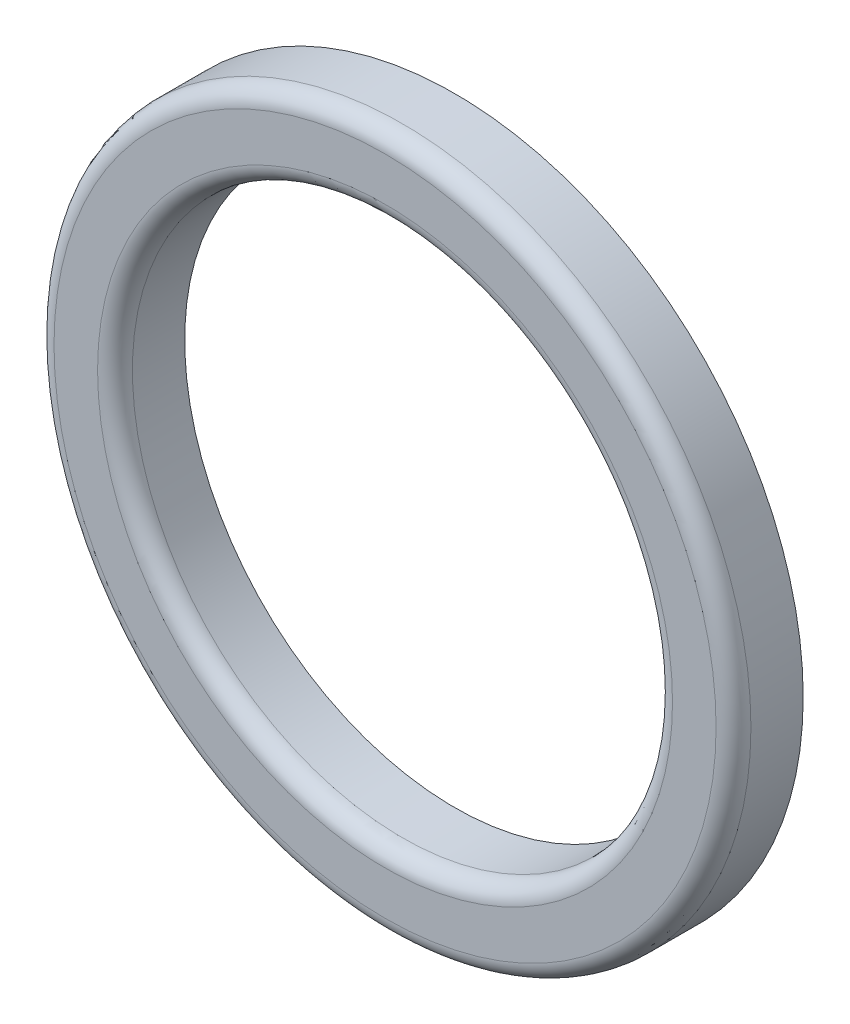
ISO-10303-21;
HEADER;
FILE_DESCRIPTION(('STEP AP214'),'2;1');
FILE_NAME('part.step','',(''),(''),'','','');
FILE_SCHEMA(('AUTOMOTIVE_DESIGN { 1 0 10303 214 1 1 1 1 }'));
ENDSEC;
DATA;
#1=APPLICATION_CONTEXT('core data for automotive mechanical design processes');
#2=APPLICATION_PROTOCOL_DEFINITION('international standard','automotive_design',2000,#1);
#3=PRODUCT_CONTEXT('',#1,'mechanical');
#4=PRODUCT('Part','Part','',(#3));
#5=PRODUCT_RELATED_PRODUCT_CATEGORY('part','',(#4));
#6=PRODUCT_DEFINITION_FORMATION('','',#4);
#7=PRODUCT_DEFINITION_CONTEXT('part definition',#1,'design');
#8=PRODUCT_DEFINITION('design','',#6,#7);
#9=PRODUCT_DEFINITION_SHAPE('','',#8);
#10=(LENGTH_UNIT() NAMED_UNIT(*) SI_UNIT(.MILLI.,.METRE.));
#11=(NAMED_UNIT(*) PLANE_ANGLE_UNIT() SI_UNIT($,.RADIAN.));
#12=(NAMED_UNIT(*) SI_UNIT($,.STERADIAN.) SOLID_ANGLE_UNIT());
#13=UNCERTAINTY_MEASURE_WITH_UNIT(LENGTH_MEASURE(1.E-05),#10,'distance_accuracy_value','');
#14=(GEOMETRIC_REPRESENTATION_CONTEXT(3) GLOBAL_UNCERTAINTY_ASSIGNED_CONTEXT((#13)) GLOBAL_UNIT_ASSIGNED_CONTEXT((#10,
#11,#12)) REPRESENTATION_CONTEXT('',''));
#15=CARTESIAN_POINT('',(0.,0.,0.));
#16=DIRECTION('',(0.,0.,1.));
#17=DIRECTION('',(1.,0.,0.));
#18=AXIS2_PLACEMENT_3D('',#15,#16,#17);
#19=CARTESIAN_POINT('',(0.,0.,2.));
#20=DIRECTION('',(0.,0.,1.));
#21=DIRECTION('',(1.,0.,0.));
#22=AXIS2_PLACEMENT_3D('',#19,#20,#21);
#23=PLANE('',#22);
#24=CARTESIAN_POINT('',(0.,0.,2.));
#25=DIRECTION('',(0.,0.,1.));
#26=DIRECTION('',(1.,0.,0.));
#27=AXIS2_PLACEMENT_3D('',#24,#25,#26);
#28=CIRCLE('',#27,8.25);
#29=CARTESIAN_POINT('',(8.25,0.,2.));
#30=VERTEX_POINT('',#29);
#31=EDGE_CURVE('E37',#30,#30,#28,.F.);
#32=ORIENTED_EDGE('',*,*,#31,.T.);
#33=EDGE_LOOP('',(#32));
#34=FACE_BOUND('',#33,.T.);
#35=CARTESIAN_POINT('',(0.,0.,2.));
#36=DIRECTION('',(0.,0.,1.));
#37=DIRECTION('',(1.,0.,0.));
#38=AXIS2_PLACEMENT_3D('',#35,#36,#37);
#39=CIRCLE('',#38,9.5);
#40=CARTESIAN_POINT('',(9.5,0.,2.));
#41=VERTEX_POINT('',#40);
#42=EDGE_CURVE('E41',#41,#41,#39,.T.);
#43=ORIENTED_EDGE('',*,*,#42,.T.);
#44=EDGE_LOOP('',(#43));
#45=FACE_BOUND('',#44,.T.);
#46=ADVANCED_FACE('F30',(#34,#45),#23,.T.);
#47=CARTESIAN_POINT('',(0.,0.,0.));
#48=DIRECTION('',(0.,0.,1.));
#49=DIRECTION('',(1.,0.,0.));
#50=AXIS2_PLACEMENT_3D('',#47,#48,#49);
#51=PLANE('',#50);
#52=CARTESIAN_POINT('',(0.,0.,0.));
#53=DIRECTION('',(0.,0.,1.));
#54=DIRECTION('',(1.,0.,0.));
#55=AXIS2_PLACEMENT_3D('',#52,#53,#54);
#56=CIRCLE('',#55,10.);
#57=CARTESIAN_POINT('',(10.,0.,0.));
#58=VERTEX_POINT('',#57);
#59=EDGE_CURVE('E50',#58,#58,#56,.T.);
#60=ORIENTED_EDGE('',*,*,#59,.F.);
#61=EDGE_LOOP('',(#60));
#62=FACE_BOUND('',#61,.T.);
#63=CARTESIAN_POINT('',(0.,0.,0.));
#64=DIRECTION('',(0.,0.,1.));
#65=DIRECTION('',(1.,0.,0.));
#66=AXIS2_PLACEMENT_3D('',#63,#64,#65);
#67=CIRCLE('',#66,7.75);
#68=CARTESIAN_POINT('',(7.75,0.,0.));
#69=VERTEX_POINT('',#68);
#70=EDGE_CURVE('E53',#69,#69,#67,.T.);
#71=ORIENTED_EDGE('',*,*,#70,.T.);
#72=EDGE_LOOP('',(#71));
#73=FACE_BOUND('',#72,.T.);
#74=ADVANCED_FACE('F57',(#62,#73),#51,.F.);
#75=CARTESIAN_POINT('',(0.,0.,2.));
#76=DIRECTION('',(0.,0.,-1.));
#77=DIRECTION('',(-1.,0.,0.));
#78=AXIS2_PLACEMENT_3D('',#75,#76,#77);
#79=CYLINDRICAL_SURFACE('',#78,10.);
#80=CARTESIAN_POINT('',(0.,0.,1.5));
#81=DIRECTION('',(0.,0.,1.));
#82=DIRECTION('',(1.,0.,0.));
#83=AXIS2_PLACEMENT_3D('',#80,#81,#82);
#84=CIRCLE('',#83,10.);
#85=CARTESIAN_POINT('',(10.,0.,1.5));
#86=VERTEX_POINT('',#85);
#87=EDGE_CURVE('E10',#86,#86,#84,.F.);
#88=ORIENTED_EDGE('',*,*,#87,.T.);
#89=EDGE_LOOP('',(#88));
#90=FACE_BOUND('',#89,.T.);
#91=ORIENTED_EDGE('',*,*,#59,.T.);
#92=EDGE_LOOP('',(#91));
#93=FACE_BOUND('',#92,.T.);
#94=ADVANCED_FACE('F62',(#90,#93),#79,.T.);
#95=CARTESIAN_POINT('',(0.,0.,2.));
#96=DIRECTION('',(0.,0.,-1.));
#97=DIRECTION('',(-1.,0.,0.));
#98=AXIS2_PLACEMENT_3D('',#95,#96,#97);
#99=CYLINDRICAL_SURFACE('',#98,7.75);
#100=CARTESIAN_POINT('',(0.,0.,1.5));
#101=DIRECTION('',(0.,0.,1.));
#102=DIRECTION('',(1.,0.,0.));
#103=AXIS2_PLACEMENT_3D('',#100,#101,#102);
#104=CIRCLE('',#103,7.75);
#105=CARTESIAN_POINT('',(7.75,0.,1.5));
#106=VERTEX_POINT('',#105);
#107=EDGE_CURVE('E45',#106,#106,#104,.T.);
#108=ORIENTED_EDGE('',*,*,#107,.T.);
#109=EDGE_LOOP('',(#108));
#110=FACE_BOUND('',#109,.T.);
#111=ORIENTED_EDGE('',*,*,#70,.F.);
#112=EDGE_LOOP('',(#111));
#113=FACE_BOUND('',#112,.T.);
#114=ADVANCED_FACE('F59',(#110,#113),#99,.F.);
#115=CARTESIAN_POINT('',(0.,0.,1.5));
#116=DIRECTION('',(0.,0.,1.));
#117=DIRECTION('',(1.,0.,0.));
#118=AXIS2_PLACEMENT_3D('',#115,#116,#117);
#119=TOROIDAL_SURFACE('',#118,8.25,0.5);
#120=ORIENTED_EDGE('',*,*,#31,.F.);
#121=EDGE_LOOP('',(#120));
#122=FACE_BOUND('',#121,.T.);
#123=ORIENTED_EDGE('',*,*,#107,.F.);
#124=EDGE_LOOP('',(#123));
#125=FACE_BOUND('',#124,.T.);
#126=ADVANCED_FACE('F61',(#122,#125),#119,.T.);
#127=CARTESIAN_POINT('',(0.,0.,1.5));
#128=DIRECTION('',(0.,0.,1.));
#129=DIRECTION('',(1.,0.,0.));
#130=AXIS2_PLACEMENT_3D('',#127,#128,#129);
#131=TOROIDAL_SURFACE('',#130,9.5,0.5);
#132=ORIENTED_EDGE('',*,*,#87,.F.);
#133=EDGE_LOOP('',(#132));
#134=FACE_BOUND('',#133,.T.);
#135=ORIENTED_EDGE('',*,*,#42,.F.);
#136=EDGE_LOOP('',(#135));
#137=FACE_BOUND('',#136,.T.);
#138=ADVANCED_FACE('F32',(#134,#137),#131,.T.);
#139=CLOSED_SHELL('',(#46,#74,#94,#114,#126,#138));
#140=MANIFOLD_SOLID_BREP('B2',#139);
#141=ADVANCED_BREP_SHAPE_REPRESENTATION('',(#18,#140),#14);
#142=SHAPE_DEFINITION_REPRESENTATION(#9,#141);
ENDSEC;
END-ISO-10303-21;
